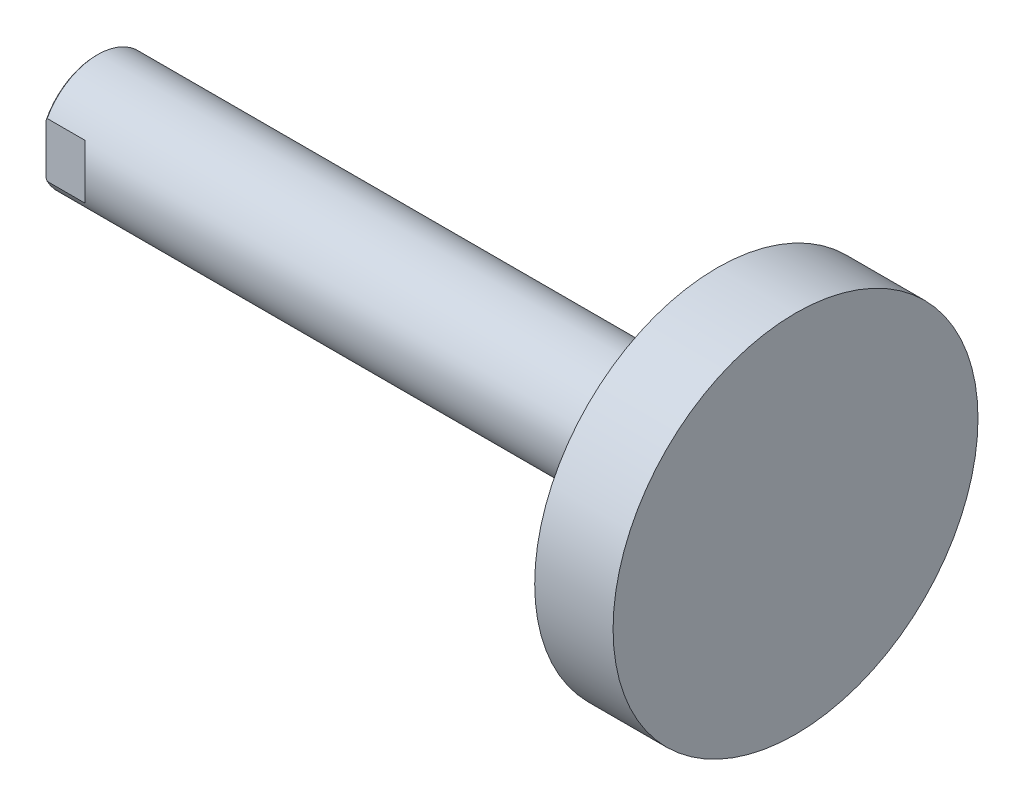
ISO-10303-21;
HEADER;
FILE_DESCRIPTION(('STEP AP214'),'2;1');
FILE_NAME('part.step','',(''),(''),'','','');
FILE_SCHEMA(('AUTOMOTIVE_DESIGN { 1 0 10303 214 1 1 1 1 }'));
ENDSEC;
DATA;
#1=APPLICATION_CONTEXT('core data for automotive mechanical design processes');
#2=APPLICATION_PROTOCOL_DEFINITION('international standard','automotive_design',2000,#1);
#3=PRODUCT_CONTEXT('',#1,'mechanical');
#4=PRODUCT('Part','Part','',(#3));
#5=PRODUCT_RELATED_PRODUCT_CATEGORY('part','',(#4));
#6=PRODUCT_DEFINITION_FORMATION('','',#4);
#7=PRODUCT_DEFINITION_CONTEXT('part definition',#1,'design');
#8=PRODUCT_DEFINITION('design','',#6,#7);
#9=PRODUCT_DEFINITION_SHAPE('','',#8);
#10=(LENGTH_UNIT() NAMED_UNIT(*) SI_UNIT(.MILLI.,.METRE.));
#11=(NAMED_UNIT(*) PLANE_ANGLE_UNIT() SI_UNIT($,.RADIAN.));
#12=(NAMED_UNIT(*) SI_UNIT($,.STERADIAN.) SOLID_ANGLE_UNIT());
#13=UNCERTAINTY_MEASURE_WITH_UNIT(LENGTH_MEASURE(1.E-05),#10,'distance_accuracy_value','');
#14=(GEOMETRIC_REPRESENTATION_CONTEXT(3) GLOBAL_UNCERTAINTY_ASSIGNED_CONTEXT((#13)) GLOBAL_UNIT_ASSIGNED_CONTEXT((#10,
#11,#12)) REPRESENTATION_CONTEXT('',''));
#15=CARTESIAN_POINT('',(0.,0.,0.));
#16=DIRECTION('',(0.,0.,1.));
#17=DIRECTION('',(1.,0.,0.));
#18=AXIS2_PLACEMENT_3D('',#15,#16,#17);
#19=CARTESIAN_POINT('',(-9.75,0.,0.));
#20=DIRECTION('',(1.,0.,0.));
#21=DIRECTION('',(0.,0.,-1.));
#22=AXIS2_PLACEMENT_3D('',#19,#20,#21);
#23=CONICAL_SURFACE('',#22,12.5,0.785398163397448);
#24=CARTESIAN_POINT('',(-9.75,0.,0.));
#25=DIRECTION('',(-1.,0.,0.));
#26=DIRECTION('',(0.,0.,1.));
#27=AXIS2_PLACEMENT_3D('',#24,#25,#26);
#28=CIRCLE('',#27,12.5);
#29=CARTESIAN_POINT('',(-9.75,5.93717104351896,11.));
#30=VERTEX_POINT('',#29);
#31=CARTESIAN_POINT('',(-9.75,5.93717104351896,-11.));
#32=VERTEX_POINT('',#31);
#33=EDGE_CURVE('E176',#30,#32,#28,.T.);
#34=ORIENTED_EDGE('',*,*,#33,.T.);
#35=CARTESIAN_POINT('',(5.25094998125094,25.2052028333689,-11.));
#36=CARTESIAN_POINT('',(4.9103650872119,24.8335854736574,-11.));
#37=CARTESIAN_POINT('',(4.57042357767404,24.4613769244969,-11.));
#38=CARTESIAN_POINT('',(3.89202781534468,23.7156015772911,-11.));
#39=CARTESIAN_POINT('',(3.55357357480577,23.3420347681021,-11.));
#40=CARTESIAN_POINT('',(2.8782782464606,22.5932842133651,-11.));
#41=CARTESIAN_POINT('',(2.54143756096285,22.2181001047901,-11.));
#42=CARTESIAN_POINT('',(1.86970520826312,21.4659918165468,-11.));
#43=CARTESIAN_POINT('',(1.53481353690619,21.0890676405911,-11.));
#44=CARTESIAN_POINT('',(0.865078654227177,20.3307330466881,-11.));
#45=CARTESIAN_POINT('',(0.530250367397127,19.9493094402016,-11.));
#46=CARTESIAN_POINT('',(-0.136743547116972,19.1841411439558,-11.));
#47=CARTESIAN_POINT('',(-0.468909181293805,18.8003964598604,-11.));
#48=CARTESIAN_POINT('',(-1.13007171696173,18.03026250746,-11.));
#49=CARTESIAN_POINT('',(-1.45906898302642,17.6438735523905,-11.));
#50=CARTESIAN_POINT('',(-2.11335019670541,16.8679631388053,-11.));
#51=CARTESIAN_POINT('',(-2.43863416058731,16.4784416940256,-11.));
#52=CARTESIAN_POINT('',(-3.03033706363172,15.761635859242,-11.));
#53=CARTESIAN_POINT('',(-3.29744294189982,15.4349188477261,-11.));
#54=CARTESIAN_POINT('',(-3.82803982216579,14.7785638813362,-11.));
#55=CARTESIAN_POINT('',(-4.09153085710636,14.4489259531261,-11.));
#56=CARTESIAN_POINT('',(-4.61431841723602,13.7861803187738,-11.));
#57=CARTESIAN_POINT('',(-4.87361370020191,13.4530716313618,-11.));
#58=CARTESIAN_POINT('',(-5.38710365166109,12.782943238648,-11.));
#59=CARTESIAN_POINT('',(-5.64129836187895,12.4459235653751,-11.));
#60=CARTESIAN_POINT('',(-6.14323523693278,11.7677449275209,-11.));
#61=CARTESIAN_POINT('',(-6.3909849603683,11.4265915697217,-11.));
#62=CARTESIAN_POINT('',(-6.8790348061764,10.7389597517523,-11.));
#63=CARTESIAN_POINT('',(-7.11933460387199,10.392481060479,-11.));
#64=CARTESIAN_POINT('',(-7.59063944651257,9.69347537854798,-11.));
#65=CARTESIAN_POINT('',(-7.82164884698285,9.34095133530365,-11.));
#66=CARTESIAN_POINT('',(-8.27222401416436,8.62869137213185,-11.));
#67=CARTESIAN_POINT('',(-8.4917912228538,8.26895636890081,-11.));
#68=CARTESIAN_POINT('',(-8.91348132701877,7.54636132080305,-11.));
#69=CARTESIAN_POINT('',(-9.115811694417,7.18362307445321,-11.));
#70=CARTESIAN_POINT('',(-9.50288634023469,6.4487571808701,-11.));
#71=CARTESIAN_POINT('',(-9.68762883781531,6.07662858764415,-11.));
#72=CARTESIAN_POINT('',(-10.0345703424154,5.32246846695183,-11.));
#73=CARTESIAN_POINT('',(-10.1967971560009,4.94044985833329,-11.));
#74=CARTESIAN_POINT('',(-10.493120622469,4.16559294332912,-11.));
#75=CARTESIAN_POINT('',(-10.6272253089455,3.77275776326928,-11.));
#76=CARTESIAN_POINT('',(-10.8369816223044,3.05759714951435,-11.));
#77=CARTESIAN_POINT('',(-10.9189726872613,2.73714186127445,-11.));
#78=CARTESIAN_POINT('',(-11.0575184049661,2.09074106475714,-11.));
#79=CARTESIAN_POINT('',(-11.1140765867247,1.76479632469953,-11.));
#80=CARTESIAN_POINT('',(-11.1988841166939,1.11004520049048,-11.));
#81=CARTESIAN_POINT('',(-11.2272059946827,0.781248347837191,-11.));
#82=CARTESIAN_POINT('',(-11.2542421636548,0.122424826321376,-11.));
#83=CARTESIAN_POINT('',(-11.2529569987328,-0.207601819829541,-11.));
#84=CARTESIAN_POINT('',(-11.2208581043342,-0.866093250187172,-11.));
#85=CARTESIAN_POINT('',(-11.1900531979829,-1.19455847160722,-11.));
#86=CARTESIAN_POINT('',(-11.1006018697956,-1.84764506084323,-11.));
#87=CARTESIAN_POINT('',(-11.0419530565988,-2.1722660960482,-11.));
#88=CARTESIAN_POINT('',(-10.8994295660662,-2.81684397353611,-11.));
#89=CARTESIAN_POINT('',(-10.8154817059412,-3.13678442237635,-11.));
#90=CARTESIAN_POINT('',(-10.6258017011829,-3.77005356106131,-11.));
#91=CARTESIAN_POINT('',(-10.5200698496469,-4.08338233980164,-11.));
#92=CARTESIAN_POINT('',(-10.2618792638845,-4.7795179377778,-11.));
#93=CARTESIAN_POINT('',(-10.1043260829511,-5.16042476598135,-11.));
#94=CARTESIAN_POINT('',(-9.76642003399069,-5.91207029729622,-11.));
#95=CARTESIAN_POINT('',(-9.58605599587668,-6.28280390977929,-11.));
#96=CARTESIAN_POINT('',(-9.20698886083907,-7.01559986878284,-11.));
#97=CARTESIAN_POINT('',(-9.0082513976985,-7.37764430265481,-11.));
#98=CARTESIAN_POINT('',(-8.59652040496553,-8.09340284342797,-11.));
#99=CARTESIAN_POINT('',(-8.38352912627252,-8.44711825374137,-11.));
#100=CARTESIAN_POINT('',(-7.94381186111511,-9.15114086376909,-11.));
#101=CARTESIAN_POINT('',(-7.71696338169999,-9.50137119805344,-11.));
#102=CARTESIAN_POINT('',(-7.25388939167467,-10.1955964856657,-11.));
#103=CARTESIAN_POINT('',(-7.01766306482386,-10.5395908924108,-11.));
#104=CARTESIAN_POINT('',(-6.53752629218754,-11.222332407997,-11.));
#105=CARTESIAN_POINT('',(-6.29361328717913,-11.5610777119778,-11.));
#106=CARTESIAN_POINT('',(-5.79954248273594,-12.2339543947134,-11.));
#107=CARTESIAN_POINT('',(-5.54938488102968,-12.5680859190396,-11.));
#108=CARTESIAN_POINT('',(-4.87914879908236,-13.4489245258157,-11.));
#109=CARTESIAN_POINT('',(-4.45459865738388,-13.9922276971137,-11.));
#110=CARTESIAN_POINT('',(-3.59503610119449,-15.0702760895548,-11.));
#111=CARTESIAN_POINT('',(-3.16002576167577,-15.6050229735101,-11.));
#112=CARTESIAN_POINT('',(-2.28157958522045,-16.6681577322177,-11.));
#113=CARTESIAN_POINT('',(-1.83813815340654,-17.1965409751859,-11.));
#114=CARTESIAN_POINT('',(-0.944855608259171,-18.2479030109718,-11.));
#115=CARTESIAN_POINT('',(-0.495014186195466,-18.7708815409554,-11.));
#116=CARTESIAN_POINT('',(0.391390005364524,-19.7912540281525,-11.));
#117=CARTESIAN_POINT('',(0.827749999905334,-20.2888243805989,-11.));
#118=CARTESIAN_POINT('',(1.70430193955479,-21.2805623076763,-11.));
#119=CARTESIAN_POINT('',(2.14449382880667,-21.7747299317207,-11.));
#120=CARTESIAN_POINT('',(3.02754870737018,-22.7596591351864,-11.));
#121=CARTESIAN_POINT('',(3.47040809940997,-23.25042394294,-11.));
#122=CARTESIAN_POINT('',(4.35879831842188,-24.2295280824776,-11.));
#123=CARTESIAN_POINT('',(4.80432913838455,-24.7178674206196,-11.));
#124=CARTESIAN_POINT('',(5.25094998125094,-25.2052028333689,-11.));
#125=B_SPLINE_CURVE_WITH_KNOTS('',3,(#35,#36,#37,#38,#39,#40,#41,#42,#43,#44,#45,#46,#47,#48,
#49,#50,#51,#52,#53,#54,#55,#56,#57,#58,#59,#60,#61,#62,#63,#64,#65,#66,#67,#68,#69,#70,#71,#72,
#73,#74,#75,#76,#77,#78,#79,#80,#81,#82,#83,#84,#85,#86,#87,#88,#89,#90,#91,#92,#93,#94,#95,#96,
#97,#98,#99,#100,#101,#102,#103,#104,#105,#106,#107,#108,#109,#110,#111,#112,#113,#114,#115,
#116,#117,#118,#119,#120,#121,#122,#123,#124),.UNSPECIFIED.,.F.,.F.,(4,2,2,2,2,2,2,2,2,2,2,2,2,
2,2,2,2,2,2,2,2,2,2,2,2,2,2,2,2,2,2,2,2,2,2,2,2,2,2,2,2,2,2,2,4),(0.,1.51224355640803,
3.02449954787464,4.53711478010658,6.04972678653934,7.57232770824369,9.09492491600938,
10.6173447784016,12.1397579686666,13.4057563520585,14.6717431905043,15.9380982296729,
17.2044429053611,18.4692285558039,19.7340692499056,20.9983098791205,22.2623907978512,
23.5080633162172,24.7538618298238,25.9981078419638,27.24199792708,28.2334443358525,
29.2247531312318,30.2135089686449,31.202246635504,32.1906888717211,33.1792160151978,
34.1706305847227,35.1620318159193,36.3976706763348,37.6339169679055,38.872524251799,
40.1109363997696,41.3625883521976,42.6143494873368,43.8665318842327,45.1186746822686,
47.1870042485993,49.2549268544645,51.3242732597304,53.393719829319,55.3791123735125,
57.3644760253395,59.3475870970137,61.3306929675574),.UNSPECIFIED.);
#126=CARTESIAN_POINT('',(-10.,5.39096466321196,-11.));
#127=VERTEX_POINT('',#126);
#128=EDGE_CURVE('E178',#32,#127,#125,.T.);
#129=ORIENTED_EDGE('',*,*,#128,.T.);
#130=CARTESIAN_POINT('',(-10.,0.,0.));
#131=DIRECTION('',(-1.,0.,0.));
#132=DIRECTION('',(0.,0.,1.));
#133=AXIS2_PLACEMENT_3D('',#130,#131,#132);
#134=CIRCLE('',#133,12.25);
#135=CARTESIAN_POINT('',(-10.,5.39096466321196,11.));
#136=VERTEX_POINT('',#135);
#137=EDGE_CURVE('E185',#136,#127,#134,.T.);
#138=ORIENTED_EDGE('',*,*,#137,.F.);
#139=CARTESIAN_POINT('',(5.25094998125094,-25.2052028333689,11.));
#140=CARTESIAN_POINT('',(4.9103650872119,-24.8335854736574,11.));
#141=CARTESIAN_POINT('',(4.57042357767404,-24.4613769244969,11.));
#142=CARTESIAN_POINT('',(3.89202781534468,-23.7156015772911,11.));
#143=CARTESIAN_POINT('',(3.55357357480577,-23.3420347681021,11.));
#144=CARTESIAN_POINT('',(2.8782782464606,-22.5932842133651,11.));
#145=CARTESIAN_POINT('',(2.54143756096285,-22.2181001047901,11.));
#146=CARTESIAN_POINT('',(1.86970520826312,-21.4659918165468,11.));
#147=CARTESIAN_POINT('',(1.53481353690619,-21.0890676405911,11.));
#148=CARTESIAN_POINT('',(0.865078654227177,-20.3307330466881,11.));
#149=CARTESIAN_POINT('',(0.530250367397127,-19.9493094402016,11.));
#150=CARTESIAN_POINT('',(-0.136743547116972,-19.1841411439558,11.));
#151=CARTESIAN_POINT('',(-0.468909181293805,-18.8003964598604,11.));
#152=CARTESIAN_POINT('',(-1.13007171696173,-18.03026250746,11.));
#153=CARTESIAN_POINT('',(-1.45906898302642,-17.6438735523905,11.));
#154=CARTESIAN_POINT('',(-2.11335019670541,-16.8679631388053,11.));
#155=CARTESIAN_POINT('',(-2.43863416058731,-16.4784416940256,11.));
#156=CARTESIAN_POINT('',(-3.03033706363172,-15.761635859242,11.));
#157=CARTESIAN_POINT('',(-3.29744294189982,-15.4349188477261,11.));
#158=CARTESIAN_POINT('',(-3.82803982216579,-14.7785638813362,11.));
#159=CARTESIAN_POINT('',(-4.09153085710636,-14.4489259531261,11.));
#160=CARTESIAN_POINT('',(-4.61431841723602,-13.7861803187738,11.));
#161=CARTESIAN_POINT('',(-4.87361370020191,-13.4530716313618,11.));
#162=CARTESIAN_POINT('',(-5.38710365166109,-12.782943238648,11.));
#163=CARTESIAN_POINT('',(-5.64129836187895,-12.4459235653751,11.));
#164=CARTESIAN_POINT('',(-6.14323523693278,-11.7677449275209,11.));
#165=CARTESIAN_POINT('',(-6.3909849603683,-11.4265915697217,11.));
#166=CARTESIAN_POINT('',(-6.8790348061764,-10.7389597517523,11.));
#167=CARTESIAN_POINT('',(-7.11933460387199,-10.392481060479,11.));
#168=CARTESIAN_POINT('',(-7.59063944651257,-9.69347537854798,11.));
#169=CARTESIAN_POINT('',(-7.82164884698285,-9.34095133530365,11.));
#170=CARTESIAN_POINT('',(-8.27222401416436,-8.62869137213185,11.));
#171=CARTESIAN_POINT('',(-8.4917912228538,-8.26895636890081,11.));
#172=CARTESIAN_POINT('',(-8.91348132701877,-7.54636132080305,11.));
#173=CARTESIAN_POINT('',(-9.115811694417,-7.18362307445321,11.));
#174=CARTESIAN_POINT('',(-9.50288634023469,-6.4487571808701,11.));
#175=CARTESIAN_POINT('',(-9.68762883781531,-6.07662858764415,11.));
#176=CARTESIAN_POINT('',(-10.0345703424154,-5.32246846695183,11.));
#177=CARTESIAN_POINT('',(-10.1967971560009,-4.94044985833329,11.));
#178=CARTESIAN_POINT('',(-10.493120622469,-4.16559294332912,11.));
#179=CARTESIAN_POINT('',(-10.6272253089455,-3.77275776326928,11.));
#180=CARTESIAN_POINT('',(-10.8369816223044,-3.05759714951435,11.));
#181=CARTESIAN_POINT('',(-10.9189726872613,-2.73714186127445,11.));
#182=CARTESIAN_POINT('',(-11.0575184049661,-2.09074106475714,11.));
#183=CARTESIAN_POINT('',(-11.1140765867247,-1.76479632469953,11.));
#184=CARTESIAN_POINT('',(-11.1988841166939,-1.11004520049048,11.));
#185=CARTESIAN_POINT('',(-11.2272059946827,-0.781248347837191,11.));
#186=CARTESIAN_POINT('',(-11.2542421636548,-0.122424826321376,11.));
#187=CARTESIAN_POINT('',(-11.2529569987328,0.207601819829541,11.));
#188=CARTESIAN_POINT('',(-11.2208581043342,0.866093250187172,11.));
#189=CARTESIAN_POINT('',(-11.1900531979829,1.19455847160722,11.));
#190=CARTESIAN_POINT('',(-11.1006018697956,1.84764506084323,11.));
#191=CARTESIAN_POINT('',(-11.0419530565988,2.1722660960482,11.));
#192=CARTESIAN_POINT('',(-10.8994295660662,2.81684397353611,11.));
#193=CARTESIAN_POINT('',(-10.8154817059412,3.13678442237635,11.));
#194=CARTESIAN_POINT('',(-10.6258017011829,3.77005356106131,11.));
#195=CARTESIAN_POINT('',(-10.5200698496469,4.08338233980164,11.));
#196=CARTESIAN_POINT('',(-10.2618792638845,4.7795179377778,11.));
#197=CARTESIAN_POINT('',(-10.1043260829511,5.16042476598135,11.));
#198=CARTESIAN_POINT('',(-9.76642003399069,5.91207029729622,11.));
#199=CARTESIAN_POINT('',(-9.58605599587668,6.28280390977929,11.));
#200=CARTESIAN_POINT('',(-9.20698886083907,7.01559986878284,11.));
#201=CARTESIAN_POINT('',(-9.0082513976985,7.37764430265481,11.));
#202=CARTESIAN_POINT('',(-8.59652040496553,8.09340284342797,11.));
#203=CARTESIAN_POINT('',(-8.38352912627252,8.44711825374137,11.));
#204=CARTESIAN_POINT('',(-7.94381186111511,9.15114086376909,11.));
#205=CARTESIAN_POINT('',(-7.71696338169999,9.50137119805344,11.));
#206=CARTESIAN_POINT('',(-7.25388939167467,10.1955964856657,11.));
#207=CARTESIAN_POINT('',(-7.01766306482386,10.5395908924108,11.));
#208=CARTESIAN_POINT('',(-6.53752629218754,11.222332407997,11.));
#209=CARTESIAN_POINT('',(-6.29361328717913,11.5610777119778,11.));
#210=CARTESIAN_POINT('',(-5.79954248273594,12.2339543947134,11.));
#211=CARTESIAN_POINT('',(-5.54938488102968,12.5680859190396,11.));
#212=CARTESIAN_POINT('',(-4.87914879908236,13.4489245258157,11.));
#213=CARTESIAN_POINT('',(-4.45459865738388,13.9922276971137,11.));
#214=CARTESIAN_POINT('',(-3.59503610119449,15.0702760895548,11.));
#215=CARTESIAN_POINT('',(-3.16002576167577,15.6050229735101,11.));
#216=CARTESIAN_POINT('',(-2.28157958522045,16.6681577322177,11.));
#217=CARTESIAN_POINT('',(-1.83813815340654,17.1965409751859,11.));
#218=CARTESIAN_POINT('',(-0.944855608259171,18.2479030109718,11.));
#219=CARTESIAN_POINT('',(-0.495014186195466,18.7708815409554,11.));
#220=CARTESIAN_POINT('',(0.391390005364524,19.7912540281525,11.));
#221=CARTESIAN_POINT('',(0.827749999905334,20.2888243805989,11.));
#222=CARTESIAN_POINT('',(1.70430193955479,21.2805623076763,11.));
#223=CARTESIAN_POINT('',(2.14449382880667,21.7747299317207,11.));
#224=CARTESIAN_POINT('',(3.02754870737018,22.7596591351864,11.));
#225=CARTESIAN_POINT('',(3.47040809940997,23.25042394294,11.));
#226=CARTESIAN_POINT('',(4.35879831842188,24.2295280824776,11.));
#227=CARTESIAN_POINT('',(4.80432913838455,24.7178674206196,11.));
#228=CARTESIAN_POINT('',(5.25094998125094,25.2052028333689,11.));
#229=B_SPLINE_CURVE_WITH_KNOTS('',3,(#139,#140,#141,#142,#143,#144,#145,#146,#147,#148,#149,
#150,#151,#152,#153,#154,#155,#156,#157,#158,#159,#160,#161,#162,#163,#164,#165,#166,#167,#168,
#169,#170,#171,#172,#173,#174,#175,#176,#177,#178,#179,#180,#181,#182,#183,#184,#185,#186,#187,
#188,#189,#190,#191,#192,#193,#194,#195,#196,#197,#198,#199,#200,#201,#202,#203,#204,#205,#206,
#207,#208,#209,#210,#211,#212,#213,#214,#215,#216,#217,#218,#219,#220,#221,#222,#223,#224,#225,
#226,#227,#228),.UNSPECIFIED.,.F.,.F.,(4,2,2,2,2,2,2,2,2,2,2,2,2,2,2,2,2,2,2,2,2,2,2,2,2,2,2,2,
2,2,2,2,2,2,2,2,2,2,2,2,2,2,2,2,4),(0.,1.51224355640803,3.02449954787464,4.53711478010658,
6.04972678653934,7.57232770824369,9.09492491600938,10.6173447784016,12.1397579686666,
13.4057563520585,14.6717431905043,15.9380982296729,17.2044429053611,18.4692285558039,
19.7340692499056,20.9983098791205,22.2623907978512,23.5080633162172,24.7538618298238,
25.9981078419638,27.24199792708,28.2334443358525,29.2247531312318,30.2135089686449,
31.202246635504,32.1906888717211,33.1792160151978,34.1706305847227,35.1620318159193,
36.3976706763348,37.6339169679055,38.872524251799,40.1109363997696,41.3625883521976,
42.6143494873368,43.8665318842327,45.1186746822686,47.1870042485993,49.2549268544645,
51.3242732597304,53.393719829319,55.3791123735125,57.3644760253395,59.3475870970137,
61.3306929675574),.UNSPECIFIED.);
#230=EDGE_CURVE('E115',#136,#30,#229,.T.);
#231=ORIENTED_EDGE('',*,*,#230,.T.);
#232=EDGE_LOOP('',(#34,#129,#138,#231));
#233=FACE_BOUND('',#232,.T.);
#234=ADVANCED_FACE('F41',(#233),#23,.T.);
#235=CARTESIAN_POINT('',(-10.,0.,0.));
#236=DIRECTION('',(1.,0.,0.));
#237=DIRECTION('',(0.,0.,-1.));
#238=AXIS2_PLACEMENT_3D('',#235,#236,#237);
#239=PLANE('',#238);
#240=CARTESIAN_POINT('',(-10.,0.,0.));
#241=DIRECTION('',(-1.,0.,0.));
#242=DIRECTION('',(0.,0.,1.));
#243=AXIS2_PLACEMENT_3D('',#240,#241,#242);
#244=CIRCLE('',#243,8.);
#245=CARTESIAN_POINT('',(-10.,0.,8.));
#246=VERTEX_POINT('',#245);
#247=EDGE_CURVE('E110',#246,#246,#244,.T.);
#248=ORIENTED_EDGE('',*,*,#247,.F.);
#249=EDGE_LOOP('',(#248));
#250=FACE_BOUND('',#249,.T.);
#251=ORIENTED_EDGE('',*,*,#137,.T.);
#252=DIRECTION('',(0.,1.,0.));
#253=VECTOR('',#252,1.);
#254=CARTESIAN_POINT('',(-10.,-22.,-11.));
#255=LINE('',#254,#253);
#256=CARTESIAN_POINT('',(-10.,-5.39096466321196,-11.));
#257=VERTEX_POINT('',#256);
#258=EDGE_CURVE('E116',#257,#127,#255,.T.);
#259=ORIENTED_EDGE('',*,*,#258,.F.);
#260=CARTESIAN_POINT('',(-10.,-5.39096466321196,11.));
#261=VERTEX_POINT('',#260);
#262=EDGE_CURVE('E181',#257,#261,#134,.T.);
#263=ORIENTED_EDGE('',*,*,#262,.T.);
#264=DIRECTION('',(0.,1.,0.));
#265=VECTOR('',#264,1.);
#266=CARTESIAN_POINT('',(-10.,-22.,11.));
#267=LINE('',#266,#265);
#268=EDGE_CURVE('E107',#261,#136,#267,.T.);
#269=ORIENTED_EDGE('',*,*,#268,.T.);
#270=EDGE_LOOP('',(#251,#259,#263,#269));
#271=FACE_BOUND('',#270,.T.);
#272=ADVANCED_FACE('F43',(#250,#271),#239,.F.);
#273=ORIENTED_EDGE('',*,*,#262,.F.);
#274=CARTESIAN_POINT('',(-9.75,-5.93717104351896,-11.));
#275=VERTEX_POINT('',#274);
#276=EDGE_CURVE('E127',#257,#275,#125,.T.);
#277=ORIENTED_EDGE('',*,*,#276,.T.);
#278=CARTESIAN_POINT('',(-9.75,-5.93717104351896,11.));
#279=VERTEX_POINT('',#278);
#280=EDGE_CURVE('E182',#275,#279,#28,.T.);
#281=ORIENTED_EDGE('',*,*,#280,.T.);
#282=EDGE_CURVE('E126',#279,#261,#229,.T.);
#283=ORIENTED_EDGE('',*,*,#282,.T.);
#284=EDGE_LOOP('',(#273,#277,#281,#283));
#285=FACE_BOUND('',#284,.T.);
#286=ADVANCED_FACE('F133',(#285),#23,.T.);
#287=CARTESIAN_POINT('',(0.,0.,0.));
#288=DIRECTION('',(-1.,0.,0.));
#289=DIRECTION('',(0.,0.,1.));
#290=AXIS2_PLACEMENT_3D('',#287,#288,#289);
#291=CYLINDRICAL_SURFACE('',#290,12.5);
#292=CARTESIAN_POINT('',(-12.5,0.,0.));
#293=DIRECTION('',(0.707106781186548,0.,0.707106781186547));
#294=DIRECTION('',(-0.707106781186547,0.,0.707106781186548));
#295=AXIS2_PLACEMENT_3D('',#292,#293,#294);
#296=ELLIPSE('',#295,17.6776695296637,12.5);
#297=CARTESIAN_POINT('',(-1.5,-5.93717104351896,-11.));
#298=VERTEX_POINT('',#297);
#299=CARTESIAN_POINT('',(-1.5,5.93717104351896,-11.));
#300=VERTEX_POINT('',#299);
#301=EDGE_CURVE('E49',#298,#300,#296,.T.);
#302=ORIENTED_EDGE('',*,*,#301,.T.);
#303=DIRECTION('',(-1.,0.,0.));
#304=VECTOR('',#303,1.);
#305=CARTESIAN_POINT('',(0.,5.93717104351896,-11.));
#306=LINE('',#305,#304);
#307=EDGE_CURVE('E11',#300,#32,#306,.T.);
#308=ORIENTED_EDGE('',*,*,#307,.T.);
#309=ORIENTED_EDGE('',*,*,#33,.F.);
#310=DIRECTION('',(-1.,0.,0.));
#311=VECTOR('',#310,1.);
#312=CARTESIAN_POINT('',(0.,5.93717104351896,11.));
#313=LINE('',#312,#311);
#314=CARTESIAN_POINT('',(-1.5,5.93717104351896,11.));
#315=VERTEX_POINT('',#314);
#316=EDGE_CURVE('E195',#30,#315,#313,.F.);
#317=ORIENTED_EDGE('',*,*,#316,.T.);
#318=CARTESIAN_POINT('',(-12.5,0.,0.));
#319=DIRECTION('',(0.707106781186548,0.,-0.707106781186547));
#320=DIRECTION('',(-0.707106781186547,0.,-0.707106781186548));
#321=AXIS2_PLACEMENT_3D('',#318,#319,#320);
#322=ELLIPSE('',#321,17.6776695296637,12.5);
#323=CARTESIAN_POINT('',(-1.5,-5.93717104351896,11.));
#324=VERTEX_POINT('',#323);
#325=EDGE_CURVE('E192',#315,#324,#322,.T.);
#326=ORIENTED_EDGE('',*,*,#325,.T.);
#327=DIRECTION('',(-1.,0.,0.));
#328=VECTOR('',#327,1.);
#329=CARTESIAN_POINT('',(0.,-5.93717104351896,11.));
#330=LINE('',#329,#328);
#331=EDGE_CURVE('E197',#324,#279,#330,.T.);
#332=ORIENTED_EDGE('',*,*,#331,.T.);
#333=ORIENTED_EDGE('',*,*,#280,.F.);
#334=DIRECTION('',(-1.,0.,0.));
#335=VECTOR('',#334,1.);
#336=CARTESIAN_POINT('',(0.,-5.93717104351896,-11.));
#337=LINE('',#336,#335);
#338=EDGE_CURVE('E200',#275,#298,#337,.F.);
#339=ORIENTED_EDGE('',*,*,#338,.T.);
#340=EDGE_LOOP('',(#302,#308,#309,#317,#326,#332,#333,#339));
#341=FACE_BOUND('',#340,.T.);
#342=CARTESIAN_POINT('',(125.4,0.,0.));
#343=DIRECTION('',(-1.,0.,0.));
#344=DIRECTION('',(0.,0.,1.));
#345=AXIS2_PLACEMENT_3D('',#342,#343,#344);
#346=CIRCLE('',#345,12.5);
#347=CARTESIAN_POINT('',(125.4,0.,12.5));
#348=VERTEX_POINT('',#347);
#349=EDGE_CURVE('E188',#348,#348,#346,.T.);
#350=ORIENTED_EDGE('',*,*,#349,.T.);
#351=EDGE_LOOP('',(#350));
#352=FACE_BOUND('',#351,.T.);
#353=ADVANCED_FACE('F157',(#341,#352),#291,.T.);
#354=CARTESIAN_POINT('',(125.4,12.5,0.));
#355=DIRECTION('',(1.,0.,0.));
#356=DIRECTION('',(0.,0.,-1.));
#357=AXIS2_PLACEMENT_3D('',#354,#355,#356);
#358=PLANE('',#357);
#359=ORIENTED_EDGE('',*,*,#349,.F.);
#360=EDGE_LOOP('',(#359));
#361=FACE_BOUND('',#360,.T.);
#362=CARTESIAN_POINT('',(125.4,0.,0.));
#363=DIRECTION('',(-1.,0.,0.));
#364=DIRECTION('',(0.,0.,1.));
#365=AXIS2_PLACEMENT_3D('',#362,#363,#364);
#366=CIRCLE('',#365,39.8);
#367=CARTESIAN_POINT('',(125.4,0.,39.8));
#368=VERTEX_POINT('',#367);
#369=EDGE_CURVE('E227',#368,#368,#366,.T.);
#370=ORIENTED_EDGE('',*,*,#369,.T.);
#371=EDGE_LOOP('',(#370));
#372=FACE_BOUND('',#371,.T.);
#373=ADVANCED_FACE('F154',(#361,#372),#358,.F.);
#374=CARTESIAN_POINT('',(142.5,0.,0.));
#375=DIRECTION('',(-1.,0.,0.));
#376=DIRECTION('',(0.,0.,1.));
#377=AXIS2_PLACEMENT_3D('',#374,#375,#376);
#378=CYLINDRICAL_SURFACE('',#377,39.8);
#379=ORIENTED_EDGE('',*,*,#369,.F.);
#380=EDGE_LOOP('',(#379));
#381=FACE_BOUND('',#380,.T.);
#382=CARTESIAN_POINT('',(142.5,0.,0.));
#383=DIRECTION('',(-1.,0.,0.));
#384=DIRECTION('',(0.,0.,1.));
#385=AXIS2_PLACEMENT_3D('',#382,#383,#384);
#386=CIRCLE('',#385,39.8);
#387=CARTESIAN_POINT('',(142.5,0.,39.8));
#388=VERTEX_POINT('',#387);
#389=EDGE_CURVE('E225',#388,#388,#386,.T.);
#390=ORIENTED_EDGE('',*,*,#389,.T.);
#391=EDGE_LOOP('',(#390));
#392=FACE_BOUND('',#391,.T.);
#393=ADVANCED_FACE('F150',(#381,#392),#378,.T.);
#394=CARTESIAN_POINT('',(142.5,39.8,0.));
#395=DIRECTION('',(-1.,0.,0.));
#396=DIRECTION('',(0.,0.,1.));
#397=AXIS2_PLACEMENT_3D('',#394,#395,#396);
#398=PLANE('',#397);
#399=ORIENTED_EDGE('',*,*,#389,.F.);
#400=EDGE_LOOP('',(#399));
#401=FACE_BOUND('',#400,.T.);
#402=ADVANCED_FACE('F147',(#401),#398,.F.);
#403=CARTESIAN_POINT('',(3.5,-22.,16.));
#404=DIRECTION('',(0.707106781186548,0.,-0.707106781186547));
#405=DIRECTION('',(-0.707106781186547,0.,-0.707106781186548));
#406=AXIS2_PLACEMENT_3D('',#403,#404,#405);
#407=PLANE('',#406);
#408=DIRECTION('',(0.,1.,0.));
#409=VECTOR('',#408,1.);
#410=CARTESIAN_POINT('',(-1.5,-22.,11.));
#411=LINE('',#410,#409);
#412=EDGE_CURVE('E63',#324,#315,#411,.T.);
#413=ORIENTED_EDGE('',*,*,#412,.F.);
#414=ORIENTED_EDGE('',*,*,#325,.F.);
#415=EDGE_LOOP('',(#413,#414));
#416=FACE_BOUND('',#415,.T.);
#417=ADVANCED_FACE('F141',(#416),#407,.F.);
#418=CARTESIAN_POINT('',(-1.5,-22.,11.));
#419=DIRECTION('',(0.,0.,-1.));
#420=DIRECTION('',(-1.,0.,0.));
#421=AXIS2_PLACEMENT_3D('',#418,#419,#420);
#422=PLANE('',#421);
#423=ORIENTED_EDGE('',*,*,#331,.F.);
#424=ORIENTED_EDGE('',*,*,#412,.T.);
#425=ORIENTED_EDGE('',*,*,#316,.F.);
#426=ORIENTED_EDGE('',*,*,#230,.F.);
#427=ORIENTED_EDGE('',*,*,#268,.F.);
#428=ORIENTED_EDGE('',*,*,#282,.F.);
#429=EDGE_LOOP('',(#423,#424,#425,#426,#427,#428));
#430=FACE_BOUND('',#429,.T.);
#431=ADVANCED_FACE('F136',(#430),#422,.F.);
#432=CARTESIAN_POINT('',(-1.5,-22.,-11.));
#433=DIRECTION('',(0.707106781186548,0.,0.707106781186547));
#434=DIRECTION('',(0.707106781186547,0.,-0.707106781186548));
#435=AXIS2_PLACEMENT_3D('',#432,#433,#434);
#436=PLANE('',#435);
#437=DIRECTION('',(0.,1.,0.));
#438=VECTOR('',#437,1.);
#439=CARTESIAN_POINT('',(-1.5,-22.,-11.));
#440=LINE('',#439,#438);
#441=EDGE_CURVE('E56',#298,#300,#440,.T.);
#442=ORIENTED_EDGE('',*,*,#441,.T.);
#443=ORIENTED_EDGE('',*,*,#301,.F.);
#444=EDGE_LOOP('',(#442,#443));
#445=FACE_BOUND('',#444,.T.);
#446=ADVANCED_FACE('F140',(#445),#436,.F.);
#447=CARTESIAN_POINT('',(-10.,-22.,-11.));
#448=DIRECTION('',(0.,0.,1.));
#449=DIRECTION('',(1.,0.,0.));
#450=AXIS2_PLACEMENT_3D('',#447,#448,#449);
#451=PLANE('',#450);
#452=ORIENTED_EDGE('',*,*,#307,.F.);
#453=ORIENTED_EDGE('',*,*,#441,.F.);
#454=ORIENTED_EDGE('',*,*,#338,.F.);
#455=ORIENTED_EDGE('',*,*,#276,.F.);
#456=ORIENTED_EDGE('',*,*,#258,.T.);
#457=ORIENTED_EDGE('',*,*,#128,.F.);
#458=EDGE_LOOP('',(#452,#453,#454,#455,#456,#457));
#459=FACE_BOUND('',#458,.T.);
#460=ADVANCED_FACE('F99',(#459),#451,.F.);
#461=CARTESIAN_POINT('',(14.,0.,0.));
#462=DIRECTION('',(-1.,0.,0.));
#463=DIRECTION('',(0.,0.,1.));
#464=AXIS2_PLACEMENT_3D('',#461,#462,#463);
#465=CONICAL_SURFACE('',#464,6.9175,1.0471975511966);
#466=CARTESIAN_POINT('',(17.9938204871192,0.,0.));
#467=VERTEX_POINT('',#466);
#468=VERTEX_LOOP('',#467);
#469=FACE_BOUND('',#468,.T.);
#470=CARTESIAN_POINT('',(14.,0.,0.));
#471=DIRECTION('',(-1.,0.,0.));
#472=DIRECTION('',(0.,0.,1.));
#473=AXIS2_PLACEMENT_3D('',#470,#471,#472);
#474=CIRCLE('',#473,6.9175);
#475=CARTESIAN_POINT('',(14.,0.,6.9175));
#476=VERTEX_POINT('',#475);
#477=EDGE_CURVE('E103',#476,#476,#474,.T.);
#478=ORIENTED_EDGE('',*,*,#477,.T.);
#479=EDGE_LOOP('',(#478));
#480=FACE_BOUND('',#479,.T.);
#481=ADVANCED_FACE('F95',(#469,#480),#465,.F.);
#482=CARTESIAN_POINT('',(-10.,0.,0.));
#483=DIRECTION('',(-1.,0.,0.));
#484=DIRECTION('',(0.,0.,1.));
#485=AXIS2_PLACEMENT_3D('',#482,#483,#484);
#486=CYLINDRICAL_SURFACE('',#485,6.9175);
#487=ORIENTED_EDGE('',*,*,#477,.F.);
#488=EDGE_LOOP('',(#487));
#489=FACE_BOUND('',#488,.T.);
#490=CARTESIAN_POINT('',(-8.9175,0.,0.));
#491=DIRECTION('',(-1.,0.,0.));
#492=DIRECTION('',(0.,0.,1.));
#493=AXIS2_PLACEMENT_3D('',#490,#491,#492);
#494=CIRCLE('',#493,6.9175);
#495=CARTESIAN_POINT('',(-8.9175,0.,6.9175));
#496=VERTEX_POINT('',#495);
#497=EDGE_CURVE('E105',#496,#496,#494,.T.);
#498=ORIENTED_EDGE('',*,*,#497,.T.);
#499=EDGE_LOOP('',(#498));
#500=FACE_BOUND('',#499,.T.);
#501=ADVANCED_FACE('F98',(#489,#500),#486,.F.);
#502=CARTESIAN_POINT('',(-10.,0.,0.));
#503=DIRECTION('',(-1.,0.,0.));
#504=DIRECTION('',(0.,0.,1.));
#505=AXIS2_PLACEMENT_3D('',#502,#503,#504);
#506=CONICAL_SURFACE('',#505,8.,0.785398163397448);
#507=ORIENTED_EDGE('',*,*,#497,.F.);
#508=EDGE_LOOP('',(#507));
#509=FACE_BOUND('',#508,.T.);
#510=ORIENTED_EDGE('',*,*,#247,.T.);
#511=EDGE_LOOP('',(#510));
#512=FACE_BOUND('',#511,.T.);
#513=ADVANCED_FACE('F211',(#509,#512),#506,.F.);
#514=CLOSED_SHELL('',(#234,#272,#286,#353,#373,#393,#402,#417,#431,#446,#460,#481,#501,#513));
#515=MANIFOLD_SOLID_BREP('B2',#514);
#516=ADVANCED_BREP_SHAPE_REPRESENTATION('',(#18,#515),#14);
#517=SHAPE_DEFINITION_REPRESENTATION(#9,#516);
ENDSEC;
END-ISO-10303-21;
